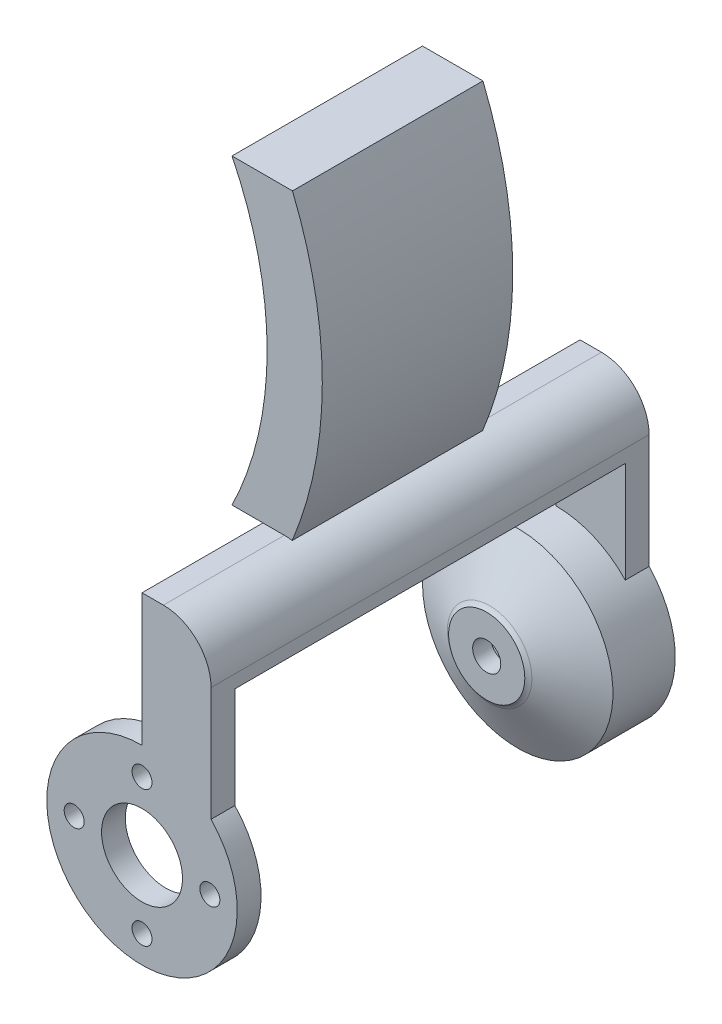
ISO-10303-21;
HEADER;
FILE_DESCRIPTION(('STEP AP214'),'2;1');
FILE_NAME('part.step','',(''),(''),'','','');
FILE_SCHEMA(('AUTOMOTIVE_DESIGN { 1 0 10303 214 1 1 1 1 }'));
ENDSEC;
DATA;
#1=APPLICATION_CONTEXT('core data for automotive mechanical design processes');
#2=APPLICATION_PROTOCOL_DEFINITION('international standard','automotive_design',2000,#1);
#3=PRODUCT_CONTEXT('',#1,'mechanical');
#4=PRODUCT('Part','Part','',(#3));
#5=PRODUCT_RELATED_PRODUCT_CATEGORY('part','',(#4));
#6=PRODUCT_DEFINITION_FORMATION('','',#4);
#7=PRODUCT_DEFINITION_CONTEXT('part definition',#1,'design');
#8=PRODUCT_DEFINITION('design','',#6,#7);
#9=PRODUCT_DEFINITION_SHAPE('','',#8);
#10=(LENGTH_UNIT() NAMED_UNIT(*) SI_UNIT(.MILLI.,.METRE.));
#11=(NAMED_UNIT(*) PLANE_ANGLE_UNIT() SI_UNIT($,.RADIAN.));
#12=(NAMED_UNIT(*) SI_UNIT($,.STERADIAN.) SOLID_ANGLE_UNIT());
#13=UNCERTAINTY_MEASURE_WITH_UNIT(LENGTH_MEASURE(1.E-05),#10,'distance_accuracy_value','');
#14=(GEOMETRIC_REPRESENTATION_CONTEXT(3) GLOBAL_UNCERTAINTY_ASSIGNED_CONTEXT((#13)) GLOBAL_UNIT_ASSIGNED_CONTEXT((#10,
#11,#12)) REPRESENTATION_CONTEXT('',''));
#15=CARTESIAN_POINT('',(0.,0.,0.));
#16=DIRECTION('',(0.,0.,1.));
#17=DIRECTION('',(1.,0.,0.));
#18=AXIS2_PLACEMENT_3D('',#15,#16,#17);
#19=CARTESIAN_POINT('',(0.,-15.875,23.));
#20=DIRECTION('',(0.,1.,0.));
#21=DIRECTION('',(-1.,0.,0.));
#22=AXIS2_PLACEMENT_3D('',#19,#20,#21);
#23=PLANE('',#22);
#24=DIRECTION('',(1.,0.,0.));
#25=VECTOR('',#24,1.);
#26=CARTESIAN_POINT('',(0.,-15.875,23.));
#27=LINE('',#26,#25);
#28=CARTESIAN_POINT('',(0.,-15.875,23.));
#29=VERTEX_POINT('',#28);
#30=CARTESIAN_POINT('',(2.25,-15.875,23.));
#31=VERTEX_POINT('',#30);
#32=EDGE_CURVE('E285',#29,#31,#27,.T.);
#33=ORIENTED_EDGE('',*,*,#32,.T.);
#34=DIRECTION('',(0.,0.,1.));
#35=VECTOR('',#34,1.);
#36=CARTESIAN_POINT('',(2.25,-15.875,23.));
#37=LINE('',#36,#35);
#38=CARTESIAN_POINT('',(2.25,-15.875,10.3));
#39=VERTEX_POINT('',#38);
#40=EDGE_CURVE('E365',#31,#39,#37,.F.);
#41=ORIENTED_EDGE('',*,*,#40,.T.);
#42=DIRECTION('',(1.,0.,0.));
#43=VECTOR('',#42,1.);
#44=CARTESIAN_POINT('',(-3.25,-15.875,10.3));
#45=LINE('',#44,#43);
#46=CARTESIAN_POINT('',(0.,-15.875,10.3));
#47=VERTEX_POINT('',#46);
#48=EDGE_CURVE('E189',#47,#39,#45,.T.);
#49=ORIENTED_EDGE('',*,*,#48,.F.);
#50=DIRECTION('',(0.,0.,-1.));
#51=VECTOR('',#50,1.);
#52=CARTESIAN_POINT('',(0.,-15.875,10.));
#53=LINE('',#52,#51);
#54=EDGE_CURVE('E333',#29,#47,#53,.T.);
#55=ORIENTED_EDGE('',*,*,#54,.F.);
#56=EDGE_LOOP('',(#33,#41,#49,#55));
#57=FACE_BOUND('',#56,.T.);
#58=ADVANCED_FACE('F49',(#57),#23,.T.);
#59=CARTESIAN_POINT('',(0.,-39.7417,-23.));
#60=DIRECTION('',(0.,0.,1.));
#61=DIRECTION('',(1.,0.,0.));
#62=AXIS2_PLACEMENT_3D('',#59,#60,#61);
#63=CYLINDRICAL_SURFACE('',#62,1.475);
#64=CARTESIAN_POINT('',(0.,-39.7417,-13.2));
#65=DIRECTION('',(0.,0.,1.));
#66=DIRECTION('',(1.,0.,0.));
#67=AXIS2_PLACEMENT_3D('',#64,#65,#66);
#68=CIRCLE('',#67,1.475);
#69=CARTESIAN_POINT('',(1.475,-39.7417,-13.2));
#70=VERTEX_POINT('',#69);
#71=EDGE_CURVE('E210',#70,#70,#68,.T.);
#72=ORIENTED_EDGE('',*,*,#71,.T.);
#73=EDGE_LOOP('',(#72));
#74=FACE_BOUND('',#73,.T.);
#75=CARTESIAN_POINT('',(0.,-39.7417,-15.1));
#76=DIRECTION('',(0.,0.,-1.));
#77=DIRECTION('',(-1.,0.,0.));
#78=AXIS2_PLACEMENT_3D('',#75,#76,#77);
#79=CIRCLE('',#78,1.475);
#80=CARTESIAN_POINT('',(-1.475,-39.7417,-15.1));
#81=VERTEX_POINT('',#80);
#82=EDGE_CURVE('E160',#81,#81,#79,.F.);
#83=ORIENTED_EDGE('',*,*,#82,.F.);
#84=EDGE_LOOP('',(#83));
#85=FACE_BOUND('',#84,.T.);
#86=ADVANCED_FACE('F447',(#74,#85),#63,.F.);
#87=CARTESIAN_POINT('',(-25.,-49.7417,-20.5));
#88=DIRECTION('',(0.,0.,-1.));
#89=DIRECTION('',(-1.,0.,0.));
#90=AXIS2_PLACEMENT_3D('',#87,#88,#89);
#91=PLANE('',#90);
#92=CARTESIAN_POINT('',(0.,-39.7417,-20.5));
#93=DIRECTION('',(0.,0.,1.));
#94=DIRECTION('',(1.,0.,0.));
#95=AXIS2_PLACEMENT_3D('',#92,#93,#94);
#96=CIRCLE('',#95,9.99999999999999);
#97=CARTESIAN_POINT('',(7.24999999999999,-32.854211343022,-20.5));
#98=VERTEX_POINT('',#97);
#99=CARTESIAN_POINT('',(0.,-29.7417,-20.5));
#100=VERTEX_POINT('',#99);
#101=EDGE_CURVE('E218',#98,#100,#96,.T.);
#102=ORIENTED_EDGE('',*,*,#101,.F.);
#103=DIRECTION('',(0.,1.,0.));
#104=VECTOR('',#103,1.);
#105=CARTESIAN_POINT('',(7.25,0.,-20.5));
#106=LINE('',#105,#104);
#107=CARTESIAN_POINT('',(7.25,-22.2417,-20.5));
#108=VERTEX_POINT('',#107);
#109=EDGE_CURVE('E256',#98,#108,#106,.T.);
#110=ORIENTED_EDGE('',*,*,#109,.T.);
#111=DIRECTION('',(1.,0.,0.));
#112=VECTOR('',#111,1.);
#113=CARTESIAN_POINT('',(-25.,-22.2417,-20.5));
#114=LINE('',#113,#112);
#115=CARTESIAN_POINT('',(0.,-22.2417,-20.5));
#116=VERTEX_POINT('',#115);
#117=EDGE_CURVE('E221',#116,#108,#114,.T.);
#118=ORIENTED_EDGE('',*,*,#117,.F.);
#119=DIRECTION('',(0.,1.,0.));
#120=VECTOR('',#119,1.);
#121=CARTESIAN_POINT('',(0.,0.,-20.5));
#122=LINE('',#121,#120);
#123=EDGE_CURVE('E260',#100,#116,#122,.T.);
#124=ORIENTED_EDGE('',*,*,#123,.F.);
#125=EDGE_LOOP('',(#102,#110,#118,#124));
#126=FACE_BOUND('',#125,.T.);
#127=ADVANCED_FACE('F425',(#126),#91,.F.);
#128=CARTESIAN_POINT('',(0.,-39.7417,23.));
#129=DIRECTION('',(0.,0.,-1.));
#130=DIRECTION('',(-1.,0.,0.));
#131=AXIS2_PLACEMENT_3D('',#128,#129,#130);
#132=CYLINDRICAL_SURFACE('',#131,10.);
#133=CARTESIAN_POINT('',(0.,-39.7417,-16.4558261025671));
#134=DIRECTION('',(0.,0.,-1.));
#135=DIRECTION('',(-1.,0.,0.));
#136=AXIS2_PLACEMENT_3D('',#133,#134,#135);
#137=CIRCLE('',#136,10.);
#138=CARTESIAN_POINT('',(-10.,-39.7417,-16.4558261025671));
#139=VERTEX_POINT('',#138);
#140=EDGE_CURVE('E347',#139,#139,#137,.T.);
#141=ORIENTED_EDGE('',*,*,#140,.T.);
#142=EDGE_LOOP('',(#141));
#143=FACE_BOUND('',#142,.T.);
#144=DIRECTION('',(0.,0.,-1.));
#145=VECTOR('',#144,1.);
#146=CARTESIAN_POINT('',(7.25,-32.854211343022,23.));
#147=LINE('',#146,#145);
#148=CARTESIAN_POINT('',(7.25,-32.854211343022,-23.));
#149=VERTEX_POINT('',#148);
#150=EDGE_CURVE('E305',#98,#149,#147,.T.);
#151=ORIENTED_EDGE('',*,*,#150,.F.);
#152=ORIENTED_EDGE('',*,*,#101,.T.);
#153=DIRECTION('',(0.,0.,-1.));
#154=VECTOR('',#153,1.);
#155=CARTESIAN_POINT('',(0.,-29.7417,23.));
#156=LINE('',#155,#154);
#157=CARTESIAN_POINT('',(0.,-29.7417,-23.));
#158=VERTEX_POINT('',#157);
#159=EDGE_CURVE('E327',#100,#158,#156,.T.);
#160=ORIENTED_EDGE('',*,*,#159,.T.);
#161=CARTESIAN_POINT('',(0.,-39.7417,-23.));
#162=DIRECTION('',(0.,0.,1.));
#163=DIRECTION('',(1.,0.,0.));
#164=AXIS2_PLACEMENT_3D('',#161,#162,#163);
#165=CIRCLE('',#164,10.);
#166=EDGE_CURVE('E309',#158,#149,#165,.T.);
#167=ORIENTED_EDGE('',*,*,#166,.T.);
#168=EDGE_LOOP('',(#151,#152,#160,#167));
#169=FACE_BOUND('',#168,.T.);
#170=ADVANCED_FACE('F421',(#143,#169),#132,.T.);
#171=CARTESIAN_POINT('',(0.,-39.7417,23.));
#172=DIRECTION('',(0.,0.,-1.));
#173=DIRECTION('',(-1.,0.,0.));
#174=AXIS2_PLACEMENT_3D('',#171,#172,#173);
#175=CYLINDRICAL_SURFACE('',#174,4.25000000000001);
#176=CARTESIAN_POINT('',(0.,-39.7417,-23.));
#177=DIRECTION('',(0.,0.,1.));
#178=DIRECTION('',(1.,0.,0.));
#179=AXIS2_PLACEMENT_3D('',#176,#177,#178);
#180=CIRCLE('',#179,4.25000000000001);
#181=CARTESIAN_POINT('',(4.25000000000001,-39.7417,-23.));
#182=VERTEX_POINT('',#181);
#183=EDGE_CURVE('E274',#182,#182,#180,.T.);
#184=ORIENTED_EDGE('',*,*,#183,.F.);
#185=EDGE_LOOP('',(#184));
#186=FACE_BOUND('',#185,.T.);
#187=CARTESIAN_POINT('',(0.,-39.7417,-15.1));
#188=DIRECTION('',(0.,0.,-1.));
#189=DIRECTION('',(-1.,0.,0.));
#190=AXIS2_PLACEMENT_3D('',#187,#188,#189);
#191=CIRCLE('',#190,4.25000000000001);
#192=CARTESIAN_POINT('',(-4.25,-39.7417,-15.1));
#193=VERTEX_POINT('',#192);
#194=EDGE_CURVE('E179',#193,#193,#191,.F.);
#195=ORIENTED_EDGE('',*,*,#194,.T.);
#196=EDGE_LOOP('',(#195));
#197=FACE_BOUND('',#196,.T.);
#198=ADVANCED_FACE('F444',(#186,#197),#175,.F.);
#199=DIRECTION('',(1.,0.,0.));
#200=VECTOR('',#199,1.);
#201=CARTESIAN_POINT('',(-3.25,-15.875,-9.7));
#202=LINE('',#201,#200);
#203=CARTESIAN_POINT('',(0.,-15.875,-9.7));
#204=VERTEX_POINT('',#203);
#205=CARTESIAN_POINT('',(2.25,-15.875,-9.7));
#206=VERTEX_POINT('',#205);
#207=EDGE_CURVE('E202',#204,#206,#202,.T.);
#208=ORIENTED_EDGE('',*,*,#207,.T.);
#209=DIRECTION('',(0.,0.,1.));
#210=VECTOR('',#209,1.);
#211=CARTESIAN_POINT('',(2.25,-15.875,23.));
#212=LINE('',#211,#210);
#213=CARTESIAN_POINT('',(2.25,-15.875,-23.));
#214=VERTEX_POINT('',#213);
#215=EDGE_CURVE('E362',#206,#214,#212,.F.);
#216=ORIENTED_EDGE('',*,*,#215,.T.);
#217=DIRECTION('',(1.,0.,0.));
#218=VECTOR('',#217,1.);
#219=CARTESIAN_POINT('',(0.,-15.875,-23.));
#220=LINE('',#219,#218);
#221=CARTESIAN_POINT('',(0.,-15.875,-23.));
#222=VERTEX_POINT('',#221);
#223=EDGE_CURVE('E316',#222,#214,#220,.T.);
#224=ORIENTED_EDGE('',*,*,#223,.F.);
#225=EDGE_CURVE('E332',#204,#222,#53,.T.);
#226=ORIENTED_EDGE('',*,*,#225,.F.);
#227=EDGE_LOOP('',(#208,#216,#224,#226));
#228=FACE_BOUND('',#227,.T.);
#229=ADVANCED_FACE('F382',(#228),#23,.T.);
#230=CARTESIAN_POINT('',(0.,0.,23.));
#231=DIRECTION('',(1.,0.,0.));
#232=DIRECTION('',(0.,1.,0.));
#233=AXIS2_PLACEMENT_3D('',#230,#231,#232);
#234=PLANE('',#233);
#235=ORIENTED_EDGE('',*,*,#159,.F.);
#236=ORIENTED_EDGE('',*,*,#123,.T.);
#237=DIRECTION('',(0.,0.,1.));
#238=VECTOR('',#237,1.);
#239=CARTESIAN_POINT('',(0.,-22.2417,23.));
#240=LINE('',#239,#238);
#241=CARTESIAN_POINT('',(0.,-22.2417,20.5));
#242=VERTEX_POINT('',#241);
#243=EDGE_CURVE('E264',#116,#242,#240,.T.);
#244=ORIENTED_EDGE('',*,*,#243,.T.);
#245=DIRECTION('',(0.,-1.,0.));
#246=VECTOR('',#245,1.);
#247=CARTESIAN_POINT('',(0.,0.,20.5));
#248=LINE('',#247,#246);
#249=CARTESIAN_POINT('',(0.,-29.7417,20.5));
#250=VERTEX_POINT('',#249);
#251=EDGE_CURVE('E252',#242,#250,#248,.T.);
#252=ORIENTED_EDGE('',*,*,#251,.T.);
#253=CARTESIAN_POINT('',(0.,-29.7417,23.));
#254=VERTEX_POINT('',#253);
#255=EDGE_CURVE('E328',#254,#250,#156,.T.);
#256=ORIENTED_EDGE('',*,*,#255,.F.);
#257=DIRECTION('',(0.,-1.,0.));
#258=VECTOR('',#257,1.);
#259=CARTESIAN_POINT('',(0.,0.,23.));
#260=LINE('',#259,#258);
#261=EDGE_CURVE('E273',#29,#254,#260,.T.);
#262=ORIENTED_EDGE('',*,*,#261,.F.);
#263=ORIENTED_EDGE('',*,*,#54,.T.);
#264=EDGE_CURVE('E338',#47,#204,#53,.T.);
#265=ORIENTED_EDGE('',*,*,#264,.T.);
#266=ORIENTED_EDGE('',*,*,#225,.T.);
#267=DIRECTION('',(0.,-1.,0.));
#268=VECTOR('',#267,1.);
#269=CARTESIAN_POINT('',(0.,0.,-23.));
#270=LINE('',#269,#268);
#271=EDGE_CURVE('E268',#222,#158,#270,.T.);
#272=ORIENTED_EDGE('',*,*,#271,.T.);
#273=EDGE_LOOP('',(#235,#236,#244,#252,#256,#262,#263,#265,#266,#272));
#274=FACE_BOUND('',#273,.T.);
#275=ADVANCED_FACE('F412',(#274),#234,.F.);
#276=CARTESIAN_POINT('',(0.,-39.7417,20.5));
#277=DIRECTION('',(0.,0.,1.));
#278=DIRECTION('',(0.,-1.,0.));
#279=AXIS2_PLACEMENT_3D('',#276,#277,#278);
#280=CIRCLE('',#279,10.);
#281=CARTESIAN_POINT('',(7.25,-32.854211343022,20.5));
#282=VERTEX_POINT('',#281);
#283=EDGE_CURVE('E249',#250,#282,#280,.T.);
#284=ORIENTED_EDGE('',*,*,#283,.T.);
#285=CARTESIAN_POINT('',(7.25,-32.854211343022,23.));
#286=VERTEX_POINT('',#285);
#287=EDGE_CURVE('E323',#286,#282,#147,.T.);
#288=ORIENTED_EDGE('',*,*,#287,.F.);
#289=CARTESIAN_POINT('',(0.,-39.7417,23.));
#290=DIRECTION('',(0.,0.,1.));
#291=DIRECTION('',(1.,0.,0.));
#292=AXIS2_PLACEMENT_3D('',#289,#290,#291);
#293=CIRCLE('',#292,10.);
#294=EDGE_CURVE('E278',#254,#286,#293,.T.);
#295=ORIENTED_EDGE('',*,*,#294,.F.);
#296=ORIENTED_EDGE('',*,*,#255,.T.);
#297=EDGE_LOOP('',(#284,#288,#295,#296));
#298=FACE_BOUND('',#297,.T.);
#299=ADVANCED_FACE('F432',(#298),#132,.T.);
#300=CARTESIAN_POINT('',(7.25,0.,23.));
#301=DIRECTION('',(1.,0.,0.));
#302=DIRECTION('',(0.,1.,0.));
#303=AXIS2_PLACEMENT_3D('',#300,#301,#302);
#304=PLANE('',#303);
#305=DIRECTION('',(0.,-1.,0.));
#306=VECTOR('',#305,1.);
#307=CARTESIAN_POINT('',(7.25,0.,-23.));
#308=LINE('',#307,#306);
#309=CARTESIAN_POINT('',(7.25,-20.875,-23.));
#310=VERTEX_POINT('',#309);
#311=EDGE_CURVE('E313',#310,#149,#308,.T.);
#312=ORIENTED_EDGE('',*,*,#311,.F.);
#313=DIRECTION('',(0.,0.,1.));
#314=VECTOR('',#313,1.);
#315=CARTESIAN_POINT('',(7.25,-20.875,23.));
#316=LINE('',#315,#314);
#317=CARTESIAN_POINT('',(7.25,-20.875,23.));
#318=VERTEX_POINT('',#317);
#319=EDGE_CURVE('E355',#310,#318,#316,.T.);
#320=ORIENTED_EDGE('',*,*,#319,.T.);
#321=DIRECTION('',(0.,-1.,0.));
#322=VECTOR('',#321,1.);
#323=CARTESIAN_POINT('',(7.25,0.,23.));
#324=LINE('',#323,#322);
#325=EDGE_CURVE('E282',#318,#286,#324,.T.);
#326=ORIENTED_EDGE('',*,*,#325,.T.);
#327=ORIENTED_EDGE('',*,*,#287,.T.);
#328=DIRECTION('',(0.,-1.,0.));
#329=VECTOR('',#328,1.);
#330=CARTESIAN_POINT('',(7.25,0.,20.5));
#331=LINE('',#330,#329);
#332=CARTESIAN_POINT('',(7.25,-22.2417,20.5));
#333=VERTEX_POINT('',#332);
#334=EDGE_CURVE('E245',#333,#282,#331,.T.);
#335=ORIENTED_EDGE('',*,*,#334,.F.);
#336=DIRECTION('',(0.,0.,1.));
#337=VECTOR('',#336,1.);
#338=CARTESIAN_POINT('',(7.25,-22.2417,23.));
#339=LINE('',#338,#337);
#340=EDGE_CURVE('E337',#108,#333,#339,.T.);
#341=ORIENTED_EDGE('',*,*,#340,.F.);
#342=ORIENTED_EDGE('',*,*,#109,.F.);
#343=ORIENTED_EDGE('',*,*,#150,.T.);
#344=EDGE_LOOP('',(#312,#320,#326,#327,#335,#341,#342,#343));
#345=FACE_BOUND('',#344,.T.);
#346=ADVANCED_FACE('F402',(#345),#304,.T.);
#347=CARTESIAN_POINT('',(7.125,-39.7417,23.));
#348=DIRECTION('',(0.,0.,-1.));
#349=DIRECTION('',(-1.,0.,0.));
#350=AXIS2_PLACEMENT_3D('',#347,#348,#349);
#351=CYLINDRICAL_SURFACE('',#350,1.05);
#352=CARTESIAN_POINT('',(7.125,-39.7417,20.5));
#353=DIRECTION('',(0.,0.,1.));
#354=DIRECTION('',(0.,-1.,0.));
#355=AXIS2_PLACEMENT_3D('',#352,#353,#354);
#356=CIRCLE('',#355,1.05);
#357=CARTESIAN_POINT('',(7.125,-40.7917,20.5));
#358=VERTEX_POINT('',#357);
#359=EDGE_CURVE('E241',#358,#358,#356,.T.);
#360=ORIENTED_EDGE('',*,*,#359,.F.);
#361=EDGE_LOOP('',(#360));
#362=FACE_BOUND('',#361,.T.);
#363=CARTESIAN_POINT('',(7.125,-39.7417,23.));
#364=DIRECTION('',(0.,0.,1.));
#365=DIRECTION('',(1.,0.,0.));
#366=AXIS2_PLACEMENT_3D('',#363,#364,#365);
#367=CIRCLE('',#366,1.05);
#368=CARTESIAN_POINT('',(8.175,-39.7417,23.));
#369=VERTEX_POINT('',#368);
#370=EDGE_CURVE('E297',#369,#369,#367,.T.);
#371=ORIENTED_EDGE('',*,*,#370,.T.);
#372=EDGE_LOOP('',(#371));
#373=FACE_BOUND('',#372,.T.);
#374=ADVANCED_FACE('F439',(#362,#373),#351,.F.);
#375=CARTESIAN_POINT('',(0.,-46.8667,23.));
#376=DIRECTION('',(0.,0.,-1.));
#377=DIRECTION('',(-1.,0.,0.));
#378=AXIS2_PLACEMENT_3D('',#375,#376,#377);
#379=CYLINDRICAL_SURFACE('',#378,1.05);
#380=CARTESIAN_POINT('',(0.,-46.8667,20.5));
#381=DIRECTION('',(0.,0.,1.));
#382=DIRECTION('',(0.,-1.,0.));
#383=AXIS2_PLACEMENT_3D('',#380,#381,#382);
#384=CIRCLE('',#383,1.05);
#385=CARTESIAN_POINT('',(0.,-47.9167,20.5));
#386=VERTEX_POINT('',#385);
#387=EDGE_CURVE('E237',#386,#386,#384,.T.);
#388=ORIENTED_EDGE('',*,*,#387,.F.);
#389=EDGE_LOOP('',(#388));
#390=FACE_BOUND('',#389,.T.);
#391=CARTESIAN_POINT('',(0.,-46.8667,23.));
#392=DIRECTION('',(0.,0.,1.));
#393=DIRECTION('',(1.,0.,0.));
#394=AXIS2_PLACEMENT_3D('',#391,#392,#393);
#395=CIRCLE('',#394,1.05);
#396=CARTESIAN_POINT('',(1.05000000000001,-46.8667,23.));
#397=VERTEX_POINT('',#396);
#398=EDGE_CURVE('E293',#397,#397,#395,.T.);
#399=ORIENTED_EDGE('',*,*,#398,.T.);
#400=EDGE_LOOP('',(#399));
#401=FACE_BOUND('',#400,.T.);
#402=ADVANCED_FACE('F666',(#390,#401),#379,.F.);
#403=CARTESIAN_POINT('',(-7.12499999999999,-39.7417,23.));
#404=DIRECTION('',(0.,0.,-1.));
#405=DIRECTION('',(-1.,0.,0.));
#406=AXIS2_PLACEMENT_3D('',#403,#404,#405);
#407=CYLINDRICAL_SURFACE('',#406,1.05);
#408=CARTESIAN_POINT('',(-7.12499999999999,-39.7417,20.5));
#409=DIRECTION('',(0.,0.,1.));
#410=DIRECTION('',(0.,-1.,0.));
#411=AXIS2_PLACEMENT_3D('',#408,#409,#410);
#412=CIRCLE('',#411,1.05);
#413=CARTESIAN_POINT('',(-7.12499999999999,-40.7917,20.5));
#414=VERTEX_POINT('',#413);
#415=EDGE_CURVE('E233',#414,#414,#412,.T.);
#416=ORIENTED_EDGE('',*,*,#415,.F.);
#417=EDGE_LOOP('',(#416));
#418=FACE_BOUND('',#417,.T.);
#419=CARTESIAN_POINT('',(-7.12499999999999,-39.7417,23.));
#420=DIRECTION('',(0.,0.,1.));
#421=DIRECTION('',(1.,0.,0.));
#422=AXIS2_PLACEMENT_3D('',#419,#420,#421);
#423=CIRCLE('',#422,1.05);
#424=CARTESIAN_POINT('',(-6.07499999999999,-39.7417,23.));
#425=VERTEX_POINT('',#424);
#426=EDGE_CURVE('E289',#425,#425,#423,.T.);
#427=ORIENTED_EDGE('',*,*,#426,.T.);
#428=EDGE_LOOP('',(#427));
#429=FACE_BOUND('',#428,.T.);
#430=ADVANCED_FACE('F480',(#418,#429),#407,.F.);
#431=CARTESIAN_POINT('',(0.,-32.6167,23.));
#432=DIRECTION('',(0.,0.,-1.));
#433=DIRECTION('',(-1.,0.,0.));
#434=AXIS2_PLACEMENT_3D('',#431,#432,#433);
#435=CYLINDRICAL_SURFACE('',#434,1.05);
#436=CARTESIAN_POINT('',(0.,-32.6167,20.5));
#437=DIRECTION('',(0.,0.,1.));
#438=DIRECTION('',(0.,-1.,0.));
#439=AXIS2_PLACEMENT_3D('',#436,#437,#438);
#440=CIRCLE('',#439,1.05);
#441=CARTESIAN_POINT('',(0.,-33.6667,20.5));
#442=VERTEX_POINT('',#441);
#443=EDGE_CURVE('E229',#442,#442,#440,.T.);
#444=ORIENTED_EDGE('',*,*,#443,.F.);
#445=EDGE_LOOP('',(#444));
#446=FACE_BOUND('',#445,.T.);
#447=CARTESIAN_POINT('',(0.,-32.6167,23.));
#448=DIRECTION('',(0.,0.,1.));
#449=DIRECTION('',(1.,0.,0.));
#450=AXIS2_PLACEMENT_3D('',#447,#448,#449);
#451=CIRCLE('',#450,1.05);
#452=CARTESIAN_POINT('',(1.05000000000001,-32.6167,23.));
#453=VERTEX_POINT('',#452);
#454=EDGE_CURVE('E269',#453,#453,#451,.T.);
#455=ORIENTED_EDGE('',*,*,#454,.T.);
#456=EDGE_LOOP('',(#455));
#457=FACE_BOUND('',#456,.T.);
#458=ADVANCED_FACE('F472',(#446,#457),#435,.F.);
#459=CARTESIAN_POINT('',(0.,-39.7417,20.5));
#460=DIRECTION('',(0.,0.,1.));
#461=DIRECTION('',(0.,-1.,0.));
#462=AXIS2_PLACEMENT_3D('',#459,#460,#461);
#463=CIRCLE('',#462,4.25000000000001);
#464=CARTESIAN_POINT('',(0.,-43.9917,20.5));
#465=VERTEX_POINT('',#464);
#466=EDGE_CURVE('E226',#465,#465,#463,.T.);
#467=ORIENTED_EDGE('',*,*,#466,.F.);
#468=EDGE_LOOP('',(#467));
#469=FACE_BOUND('',#468,.T.);
#470=CARTESIAN_POINT('',(0.,-39.7417,23.));
#471=DIRECTION('',(0.,0.,1.));
#472=DIRECTION('',(1.,0.,0.));
#473=AXIS2_PLACEMENT_3D('',#470,#471,#472);
#474=CIRCLE('',#473,4.25000000000001);
#475=CARTESIAN_POINT('',(4.25000000000001,-39.7417,23.));
#476=VERTEX_POINT('',#475);
#477=EDGE_CURVE('E301',#476,#476,#474,.T.);
#478=ORIENTED_EDGE('',*,*,#477,.T.);
#479=EDGE_LOOP('',(#478));
#480=FACE_BOUND('',#479,.T.);
#481=ADVANCED_FACE('F462',(#469,#480),#175,.F.);
#482=CARTESIAN_POINT('',(0.,0.,23.));
#483=DIRECTION('',(0.,0.,1.));
#484=DIRECTION('',(1.,0.,0.));
#485=AXIS2_PLACEMENT_3D('',#482,#483,#484);
#486=PLANE('',#485);
#487=ORIENTED_EDGE('',*,*,#325,.F.);
#488=CARTESIAN_POINT('',(2.25,-20.875,23.));
#489=DIRECTION('',(0.,0.,1.));
#490=DIRECTION('',(1.,0.,0.));
#491=AXIS2_PLACEMENT_3D('',#488,#489,#490);
#492=CIRCLE('',#491,5.);
#493=EDGE_CURVE('E359',#318,#31,#492,.T.);
#494=ORIENTED_EDGE('',*,*,#493,.T.);
#495=ORIENTED_EDGE('',*,*,#32,.F.);
#496=ORIENTED_EDGE('',*,*,#261,.T.);
#497=ORIENTED_EDGE('',*,*,#294,.T.);
#498=EDGE_LOOP('',(#487,#494,#495,#496,#497));
#499=FACE_BOUND('',#498,.T.);
#500=ORIENTED_EDGE('',*,*,#454,.F.);
#501=EDGE_LOOP('',(#500));
#502=FACE_BOUND('',#501,.T.);
#503=ORIENTED_EDGE('',*,*,#426,.F.);
#504=EDGE_LOOP('',(#503));
#505=FACE_BOUND('',#504,.T.);
#506=ORIENTED_EDGE('',*,*,#398,.F.);
#507=EDGE_LOOP('',(#506));
#508=FACE_BOUND('',#507,.T.);
#509=ORIENTED_EDGE('',*,*,#370,.F.);
#510=EDGE_LOOP('',(#509));
#511=FACE_BOUND('',#510,.T.);
#512=ORIENTED_EDGE('',*,*,#477,.F.);
#513=EDGE_LOOP('',(#512));
#514=FACE_BOUND('',#513,.T.);
#515=ADVANCED_FACE('F396',(#499,#502,#505,#508,#511,#514),#486,.T.);
#516=CARTESIAN_POINT('',(0.,0.,-23.));
#517=DIRECTION('',(0.,0.,1.));
#518=DIRECTION('',(1.,0.,0.));
#519=AXIS2_PLACEMENT_3D('',#516,#517,#518);
#520=PLANE('',#519);
#521=ORIENTED_EDGE('',*,*,#223,.T.);
#522=CARTESIAN_POINT('',(2.25,-20.875,-23.));
#523=DIRECTION('',(0.,0.,1.));
#524=DIRECTION('',(1.,0.,0.));
#525=AXIS2_PLACEMENT_3D('',#522,#523,#524);
#526=CIRCLE('',#525,5.);
#527=EDGE_CURVE('E368',#214,#310,#526,.F.);
#528=ORIENTED_EDGE('',*,*,#527,.T.);
#529=ORIENTED_EDGE('',*,*,#311,.T.);
#530=ORIENTED_EDGE('',*,*,#166,.F.);
#531=ORIENTED_EDGE('',*,*,#271,.F.);
#532=EDGE_LOOP('',(#521,#528,#529,#530,#531));
#533=FACE_BOUND('',#532,.T.);
#534=ORIENTED_EDGE('',*,*,#183,.T.);
#535=EDGE_LOOP('',(#534));
#536=FACE_BOUND('',#535,.T.);
#537=ADVANCED_FACE('F406',(#533,#536),#520,.F.);
#538=CARTESIAN_POINT('',(-25.,-22.2417,-20.5));
#539=DIRECTION('',(0.,1.,0.));
#540=DIRECTION('',(0.,0.,1.));
#541=AXIS2_PLACEMENT_3D('',#538,#539,#540);
#542=PLANE('',#541);
#543=ORIENTED_EDGE('',*,*,#117,.T.);
#544=ORIENTED_EDGE('',*,*,#340,.T.);
#545=DIRECTION('',(1.,0.,0.));
#546=VECTOR('',#545,1.);
#547=CARTESIAN_POINT('',(-25.,-22.2417,20.5));
#548=LINE('',#547,#546);
#549=EDGE_CURVE('E222',#242,#333,#548,.T.);
#550=ORIENTED_EDGE('',*,*,#549,.F.);
#551=ORIENTED_EDGE('',*,*,#243,.F.);
#552=EDGE_LOOP('',(#543,#544,#550,#551));
#553=FACE_BOUND('',#552,.T.);
#554=ADVANCED_FACE('F428',(#553),#542,.F.);
#555=CARTESIAN_POINT('',(-25.,-49.7417,20.5));
#556=DIRECTION('',(0.,0.,1.));
#557=DIRECTION('',(0.,-1.,0.));
#558=AXIS2_PLACEMENT_3D('',#555,#556,#557);
#559=PLANE('',#558);
#560=ORIENTED_EDGE('',*,*,#359,.T.);
#561=EDGE_LOOP('',(#560));
#562=FACE_BOUND('',#561,.T.);
#563=ORIENTED_EDGE('',*,*,#387,.T.);
#564=EDGE_LOOP('',(#563));
#565=FACE_BOUND('',#564,.T.);
#566=ORIENTED_EDGE('',*,*,#415,.T.);
#567=EDGE_LOOP('',(#566));
#568=FACE_BOUND('',#567,.T.);
#569=ORIENTED_EDGE('',*,*,#443,.T.);
#570=EDGE_LOOP('',(#569));
#571=FACE_BOUND('',#570,.T.);
#572=ORIENTED_EDGE('',*,*,#466,.T.);
#573=EDGE_LOOP('',(#572));
#574=FACE_BOUND('',#573,.T.);
#575=ORIENTED_EDGE('',*,*,#549,.T.);
#576=ORIENTED_EDGE('',*,*,#334,.T.);
#577=ORIENTED_EDGE('',*,*,#283,.F.);
#578=ORIENTED_EDGE('',*,*,#251,.F.);
#579=EDGE_LOOP('',(#575,#576,#577,#578));
#580=FACE_BOUND('',#579,.T.);
#581=ADVANCED_FACE('F430',(#562,#565,#568,#571,#574,#580),#559,.F.);
#582=CARTESIAN_POINT('',(0.,-39.7417,-13.2));
#583=DIRECTION('',(0.,0.,1.));
#584=DIRECTION('',(1.,0.,0.));
#585=AXIS2_PLACEMENT_3D('',#582,#583,#584);
#586=PLANE('',#585);
#587=ORIENTED_EDGE('',*,*,#71,.F.);
#588=EDGE_LOOP('',(#587));
#589=FACE_BOUND('',#588,.T.);
#590=CARTESIAN_POINT('',(0.,-39.7417,-13.2));
#591=DIRECTION('',(0.,0.,1.));
#592=DIRECTION('',(1.,0.,0.));
#593=AXIS2_PLACEMENT_3D('',#590,#591,#592);
#594=CIRCLE('',#593,4.);
#595=CARTESIAN_POINT('',(4.,-39.7417,-13.2));
#596=VERTEX_POINT('',#595);
#597=EDGE_CURVE('E214',#596,#596,#594,.T.);
#598=ORIENTED_EDGE('',*,*,#597,.T.);
#599=EDGE_LOOP('',(#598));
#600=FACE_BOUND('',#599,.T.);
#601=ADVANCED_FACE('F489',(#589,#600),#586,.T.);
#602=CARTESIAN_POINT('',(0.,-39.7417,-15.1));
#603=DIRECTION('',(0.,0.,-1.));
#604=DIRECTION('',(-1.,0.,0.));
#605=AXIS2_PLACEMENT_3D('',#602,#603,#604);
#606=PLANE('',#605);
#607=ORIENTED_EDGE('',*,*,#82,.T.);
#608=EDGE_LOOP('',(#607));
#609=FACE_BOUND('',#608,.T.);
#610=ORIENTED_EDGE('',*,*,#194,.F.);
#611=EDGE_LOOP('',(#610));
#612=FACE_BOUND('',#611,.T.);
#613=ADVANCED_FACE('F496',(#609,#612),#606,.T.);
#614=CARTESIAN_POINT('',(-3.25,-15.875,-9.7));
#615=DIRECTION('',(0.,-1.,0.));
#616=DIRECTION('',(0.,0.,-1.));
#617=AXIS2_PLACEMENT_3D('',#614,#615,#616);
#618=PLANE('',#617);
#619=ORIENTED_EDGE('',*,*,#264,.F.);
#620=CARTESIAN_POINT('',(-3.25,-15.875,10.3));
#621=VERTEX_POINT('',#620);
#622=EDGE_CURVE('E173',#621,#47,#45,.T.);
#623=ORIENTED_EDGE('',*,*,#622,.F.);
#624=DIRECTION('',(0.,0.,1.));
#625=VECTOR('',#624,1.);
#626=CARTESIAN_POINT('',(-3.25,-15.875,-9.7));
#627=LINE('',#626,#625);
#628=CARTESIAN_POINT('',(-3.25,-15.875,-9.7));
#629=VERTEX_POINT('',#628);
#630=EDGE_CURVE('E161',#629,#621,#627,.T.);
#631=ORIENTED_EDGE('',*,*,#630,.F.);
#632=EDGE_CURVE('E197',#629,#204,#202,.T.);
#633=ORIENTED_EDGE('',*,*,#632,.T.);
#634=EDGE_LOOP('',(#619,#623,#631,#633));
#635=FACE_BOUND('',#634,.T.);
#636=ADVANCED_FACE('F580',(#635),#618,.T.);
#637=CARTESIAN_POINT('',(-3.25,15.875,-9.7));
#638=DIRECTION('',(0.,-1.,0.));
#639=DIRECTION('',(0.,0.,-1.));
#640=AXIS2_PLACEMENT_3D('',#637,#638,#639);
#641=PLANE('',#640);
#642=DIRECTION('',(0.,0.,1.));
#643=VECTOR('',#642,1.);
#644=CARTESIAN_POINT('',(-3.25,15.875,-9.7));
#645=LINE('',#644,#643);
#646=CARTESIAN_POINT('',(-3.25,15.875,-9.7));
#647=VERTEX_POINT('',#646);
#648=CARTESIAN_POINT('',(-3.25,15.875,10.3));
#649=VERTEX_POINT('',#648);
#650=EDGE_CURVE('E176',#647,#649,#645,.T.);
#651=ORIENTED_EDGE('',*,*,#650,.T.);
#652=DIRECTION('',(1.,0.,0.));
#653=VECTOR('',#652,1.);
#654=CARTESIAN_POINT('',(-3.25,15.875,10.3));
#655=LINE('',#654,#653);
#656=CARTESIAN_POINT('',(3.1,15.875,10.3));
#657=VERTEX_POINT('',#656);
#658=EDGE_CURVE('E167',#649,#657,#655,.T.);
#659=ORIENTED_EDGE('',*,*,#658,.T.);
#660=DIRECTION('',(0.,0.,1.));
#661=VECTOR('',#660,1.);
#662=CARTESIAN_POINT('',(3.1,15.875,-9.7));
#663=LINE('',#662,#661);
#664=CARTESIAN_POINT('',(3.1,15.875,-9.7));
#665=VERTEX_POINT('',#664);
#666=EDGE_CURVE('E154',#665,#657,#663,.T.);
#667=ORIENTED_EDGE('',*,*,#666,.F.);
#668=DIRECTION('',(1.,0.,0.));
#669=VECTOR('',#668,1.);
#670=CARTESIAN_POINT('',(-3.25,15.875,-9.7));
#671=LINE('',#670,#669);
#672=EDGE_CURVE('E192',#647,#665,#671,.T.);
#673=ORIENTED_EDGE('',*,*,#672,.F.);
#674=EDGE_LOOP('',(#651,#659,#667,#673));
#675=FACE_BOUND('',#674,.T.);
#676=ADVANCED_FACE('F175',(#675),#641,.F.);
#677=CARTESIAN_POINT('',(-35.5607470510974,0.,-9.7));
#678=DIRECTION('',(0.,0.,1.));
#679=DIRECTION('',(1.,0.,0.));
#680=AXIS2_PLACEMENT_3D('',#677,#678,#679);
#681=CYLINDRICAL_SURFACE('',#680,41.793169149383);
#682=ORIENTED_EDGE('',*,*,#666,.T.);
#683=CARTESIAN_POINT('',(-35.5607470510974,0.,10.3));
#684=DIRECTION('',(0.,0.,-1.));
#685=DIRECTION('',(-1.,0.,0.));
#686=AXIS2_PLACEMENT_3D('',#683,#684,#685);
#687=CIRCLE('',#686,41.793169149383);
#688=CARTESIAN_POINT('',(3.07199513442295,-15.943030413822,10.3));
#689=VERTEX_POINT('',#688);
#690=EDGE_CURVE('E71',#657,#689,#687,.T.);
#691=ORIENTED_EDGE('',*,*,#690,.T.);
#692=DIRECTION('',(0.,0.,1.));
#693=VECTOR('',#692,1.);
#694=CARTESIAN_POINT('',(3.07199513442295,-15.943030413822,10.3));
#695=LINE('',#694,#693);
#696=CARTESIAN_POINT('',(3.07199513442295,-15.943030413822,-9.7));
#697=VERTEX_POINT('',#696);
#698=EDGE_CURVE('E58',#689,#697,#695,.F.);
#699=ORIENTED_EDGE('',*,*,#698,.T.);
#700=CARTESIAN_POINT('',(-35.5607470510974,0.,-9.7));
#701=DIRECTION('',(0.,0.,-1.));
#702=DIRECTION('',(-1.,0.,0.));
#703=AXIS2_PLACEMENT_3D('',#700,#701,#702);
#704=CIRCLE('',#703,41.793169149383);
#705=EDGE_CURVE('E64',#665,#697,#704,.T.);
#706=ORIENTED_EDGE('',*,*,#705,.F.);
#707=EDGE_LOOP('',(#682,#691,#699,#706));
#708=FACE_BOUND('',#707,.T.);
#709=ADVANCED_FACE('F155',(#708),#681,.T.);
#710=CARTESIAN_POINT('',(-35.5607470510974,0.,-9.7));
#711=DIRECTION('',(0.,0.,1.));
#712=DIRECTION('',(1.,0.,0.));
#713=AXIS2_PLACEMENT_3D('',#710,#711,#712);
#714=CYLINDRICAL_SURFACE('',#713,36.);
#715=ORIENTED_EDGE('',*,*,#630,.T.);
#716=CARTESIAN_POINT('',(-35.5607470510974,0.,10.3));
#717=DIRECTION('',(0.,0.,-1.));
#718=DIRECTION('',(-1.,0.,0.));
#719=AXIS2_PLACEMENT_3D('',#716,#717,#718);
#720=CIRCLE('',#719,36.);
#721=EDGE_CURVE('E188',#649,#621,#720,.T.);
#722=ORIENTED_EDGE('',*,*,#721,.F.);
#723=ORIENTED_EDGE('',*,*,#650,.F.);
#724=CARTESIAN_POINT('',(-35.5607470510974,0.,-9.7));
#725=DIRECTION('',(0.,0.,-1.));
#726=DIRECTION('',(-1.,0.,0.));
#727=AXIS2_PLACEMENT_3D('',#724,#725,#726);
#728=CIRCLE('',#727,36.);
#729=EDGE_CURVE('E201',#647,#629,#728,.T.);
#730=ORIENTED_EDGE('',*,*,#729,.T.);
#731=EDGE_LOOP('',(#715,#722,#723,#730));
#732=FACE_BOUND('',#731,.T.);
#733=ADVANCED_FACE('F515',(#732),#714,.F.);
#734=CARTESIAN_POINT('',(-35.5607470510974,0.,-9.7));
#735=DIRECTION('',(0.,0.,-1.));
#736=DIRECTION('',(-1.,0.,0.));
#737=AXIS2_PLACEMENT_3D('',#734,#735,#736);
#738=PLANE('',#737);
#739=ORIENTED_EDGE('',*,*,#672,.T.);
#740=ORIENTED_EDGE('',*,*,#705,.T.);
#741=CARTESIAN_POINT('',(2.25,-20.875,-9.7));
#742=DIRECTION('',(0.,0.,-1.));
#743=DIRECTION('',(-1.,0.,0.));
#744=AXIS2_PLACEMENT_3D('',#741,#742,#743);
#745=CIRCLE('',#744,5.);
#746=EDGE_CURVE('E11',#697,#206,#745,.F.);
#747=ORIENTED_EDGE('',*,*,#746,.T.);
#748=ORIENTED_EDGE('',*,*,#207,.F.);
#749=ORIENTED_EDGE('',*,*,#632,.F.);
#750=ORIENTED_EDGE('',*,*,#729,.F.);
#751=EDGE_LOOP('',(#739,#740,#747,#748,#749,#750));
#752=FACE_BOUND('',#751,.T.);
#753=ADVANCED_FACE('F378',(#752),#738,.T.);
#754=CARTESIAN_POINT('',(-35.5607470510974,0.,10.3));
#755=DIRECTION('',(0.,0.,-1.));
#756=DIRECTION('',(-1.,0.,0.));
#757=AXIS2_PLACEMENT_3D('',#754,#755,#756);
#758=PLANE('',#757);
#759=ORIENTED_EDGE('',*,*,#658,.F.);
#760=ORIENTED_EDGE('',*,*,#721,.T.);
#761=ORIENTED_EDGE('',*,*,#622,.T.);
#762=ORIENTED_EDGE('',*,*,#48,.T.);
#763=CARTESIAN_POINT('',(2.25,-20.875,10.3));
#764=DIRECTION('',(0.,0.,-1.));
#765=DIRECTION('',(-1.,0.,0.));
#766=AXIS2_PLACEMENT_3D('',#763,#764,#765);
#767=CIRCLE('',#766,5.);
#768=EDGE_CURVE('E170',#39,#689,#767,.T.);
#769=ORIENTED_EDGE('',*,*,#768,.T.);
#770=ORIENTED_EDGE('',*,*,#690,.F.);
#771=EDGE_LOOP('',(#759,#760,#761,#762,#769,#770));
#772=FACE_BOUND('',#771,.T.);
#773=ADVANCED_FACE('F165',(#772),#758,.F.);
#774=CARTESIAN_POINT('',(0.,-39.7417,-13.3259710170945));
#775=DIRECTION('',(0.,0.,-1.));
#776=DIRECTION('',(-1.,0.,0.));
#777=AXIS2_PLACEMENT_3D('',#774,#775,#776);
#778=CONICAL_SURFACE('',#777,4.08617908189938,1.08402802996173);
#779=CARTESIAN_POINT('',(0.,-39.7417,-13.5098849641895));
#780=DIRECTION('',(0.,0.,-1.));
#781=DIRECTION('',(-1.,0.,0.));
#782=AXIS2_PLACEMENT_3D('',#779,#780,#781);
#783=CIRCLE('',#782,4.43368211886388);
#784=CARTESIAN_POINT('',(-4.43368211886388,-39.7417,-13.5098849641895));
#785=VERTEX_POINT('',#784);
#786=EDGE_CURVE('E351',#785,#785,#783,.T.);
#787=CARTESIAN_POINT('',(-4.43368211886388,-39.7417,-13.5098849641895));
#788=CARTESIAN_POINT('',(-4.49166459679238,-39.7417,-13.5405718510476));
#789=CARTESIAN_POINT('',(-4.54964707472088,-39.7417,-13.5712587379057));
#790=CARTESIAN_POINT('',(-4.66561203057788,-39.7417,-13.6326325116219));
#791=CARTESIAN_POINT('',(-4.72359450850638,-39.7417,-13.66331939848));
#792=CARTESIAN_POINT('',(-4.83955946436339,-39.7417,-13.7246931721962));
#793=CARTESIAN_POINT('',(-4.89754194229189,-39.7417,-13.7553800590543));
#794=CARTESIAN_POINT('',(-5.01350689814889,-39.7417,-13.8167538327705));
#795=CARTESIAN_POINT('',(-5.07148937607739,-39.7417,-13.8474407196286));
#796=CARTESIAN_POINT('',(-5.18745433193439,-39.7417,-13.9088144933448));
#797=CARTESIAN_POINT('',(-5.24543680986289,-39.7417,-13.9395013802029));
#798=CARTESIAN_POINT('',(-5.3614017657199,-39.7417,-14.0008751539191));
#799=CARTESIAN_POINT('',(-5.4193842436484,-39.7417,-14.0315620407772));
#800=CARTESIAN_POINT('',(-5.5353491995054,-39.7417,-14.0929358144934));
#801=CARTESIAN_POINT('',(-5.5933316774339,-39.7417,-14.1236227013515));
#802=CARTESIAN_POINT('',(-5.70929663329091,-39.7417,-14.1849964750677));
#803=CARTESIAN_POINT('',(-5.76727911121941,-39.7417,-14.2156833619258));
#804=CARTESIAN_POINT('',(-5.88324406707641,-39.7417,-14.277057135642));
#805=CARTESIAN_POINT('',(-5.94122654500491,-39.7417,-14.3077440225001));
#806=CARTESIAN_POINT('',(-6.05719150086191,-39.7417,-14.3691177962163));
#807=CARTESIAN_POINT('',(-6.11517397879041,-39.7417,-14.3998046830744));
#808=CARTESIAN_POINT('',(-6.23113893464742,-39.7417,-14.4611784567906));
#809=CARTESIAN_POINT('',(-6.28912141257592,-39.7417,-14.4918653436487));
#810=CARTESIAN_POINT('',(-6.40508636843292,-39.7417,-14.5532391173649));
#811=CARTESIAN_POINT('',(-6.46306884636142,-39.7417,-14.583926004223));
#812=CARTESIAN_POINT('',(-6.57903380221842,-39.7417,-14.6452997779392));
#813=CARTESIAN_POINT('',(-6.63701628014692,-39.7417,-14.6759866647973));
#814=CARTESIAN_POINT('',(-6.75298123600393,-39.7417,-14.7373604385135));
#815=CARTESIAN_POINT('',(-6.81096371393243,-39.7417,-14.7680473253716));
#816=CARTESIAN_POINT('',(-6.92692866978943,-39.7417,-14.8294210990878));
#817=CARTESIAN_POINT('',(-6.98491114771793,-39.7417,-14.8601079859459));
#818=CARTESIAN_POINT('',(-7.10087610357493,-39.7417,-14.9214817596621));
#819=CARTESIAN_POINT('',(-7.15885858150344,-39.7417,-14.9521686465202));
#820=CARTESIAN_POINT('',(-7.27482353736044,-39.7417,-15.0135424202364));
#821=CARTESIAN_POINT('',(-7.33280601528894,-39.7417,-15.0442293070945));
#822=CARTESIAN_POINT('',(-7.44877097114594,-39.7417,-15.1056030808107));
#823=CARTESIAN_POINT('',(-7.50675344907444,-39.7417,-15.1362899676688));
#824=CARTESIAN_POINT('',(-7.62271840493145,-39.7417,-15.197663741385));
#825=CARTESIAN_POINT('',(-7.68070088285995,-39.7417,-15.2283506282431));
#826=CARTESIAN_POINT('',(-7.79666583871695,-39.7417,-15.2897244019593));
#827=CARTESIAN_POINT('',(-7.85464831664545,-39.7417,-15.3204112888174));
#828=CARTESIAN_POINT('',(-7.97061327250245,-39.7417,-15.3817850625336));
#829=CARTESIAN_POINT('',(-8.02859575043096,-39.7417,-15.4124719493917));
#830=CARTESIAN_POINT('',(-8.14456070628796,-39.7417,-15.4738457231079));
#831=CARTESIAN_POINT('',(-8.20254318421646,-39.7417,-15.504532609966));
#832=CARTESIAN_POINT('',(-8.31850814007346,-39.7417,-15.5659063836822));
#833=CARTESIAN_POINT('',(-8.37649061800196,-39.7417,-15.5965932705403));
#834=CARTESIAN_POINT('',(-8.49245557385897,-39.7417,-15.6579670442565));
#835=CARTESIAN_POINT('',(-8.55043805178747,-39.7417,-15.6886539311146));
#836=CARTESIAN_POINT('',(-8.66640300764447,-39.7417,-15.7500277048308));
#837=CARTESIAN_POINT('',(-8.72438548557297,-39.7417,-15.7807145916889));
#838=CARTESIAN_POINT('',(-8.84035044142997,-39.7417,-15.8420883654051));
#839=CARTESIAN_POINT('',(-8.89833291935848,-39.7417,-15.8727752522632));
#840=CARTESIAN_POINT('',(-9.01429787521548,-39.7417,-15.9341490259794));
#841=CARTESIAN_POINT('',(-9.07228035314398,-39.7417,-15.9648359128375));
#842=CARTESIAN_POINT('',(-9.18824530900098,-39.7417,-16.0262096865537));
#843=CARTESIAN_POINT('',(-9.24622778692948,-39.7417,-16.0568965734118));
#844=CARTESIAN_POINT('',(-9.36219274278649,-39.7417,-16.118270347128));
#845=CARTESIAN_POINT('',(-9.42017522071499,-39.7417,-16.1489572339861));
#846=CARTESIAN_POINT('',(-9.53614017657199,-39.7417,-16.2103310077023));
#847=CARTESIAN_POINT('',(-9.59412265450049,-39.7417,-16.2410178945604));
#848=CARTESIAN_POINT('',(-9.71008761035749,-39.7417,-16.3023916682766));
#849=CARTESIAN_POINT('',(-9.768070088286,-39.7417,-16.3330785551347));
#850=CARTESIAN_POINT('',(-9.884035044143,-39.7417,-16.3944523288509));
#851=CARTESIAN_POINT('',(-9.9420175220715,-39.7417,-16.425139215709));
#852=CARTESIAN_POINT('',(-10.,-39.7417,-16.4558261025671));
#853=B_SPLINE_CURVE_WITH_KNOTS('',3,(#787,#788,#789,#790,#791,#792,#793,#794,#795,#796,#797,
#798,#799,#800,#801,#802,#803,#804,#805,#806,#807,#808,#809,#810,#811,#812,#813,#814,#815,#816,
#817,#818,#819,#820,#821,#822,#823,#824,#825,#826,#827,#828,#829,#830,#831,#832,#833,#834,#835,
#836,#837,#838,#839,#840,#841,#842,#843,#844,#845,#846,#847,#848,#849,#850,#851,#852),
.UNSPECIFIED.,.F.,.F.,(4,2,2,2,2,2,2,2,2,2,2,2,2,2,2,2,2,2,2,2,2,2,2,2,2,2,2,2,2,2,2,2,4),(0.,
0.196806694362614,0.393613388725227,0.590420083087841,0.787226777450453,0.984033471813068,
1.18084016617568,1.37764686053829,1.57445355490091,1.77126024926352,1.96806694362613,
2.16487363798875,2.36168033235136,2.55848702671397,2.75529372107659,2.9521004154392,
3.14890710980182,3.34571380416443,3.54252049852704,3.73932719288966,3.93613388725227,
4.13294058161488,4.3297472759775,4.52655397034011,4.72336066470272,4.92016735906534,
5.11697405342795,5.31378074779056,5.51058744215318,5.70739413651579,5.90420083087841,
6.10100752524102,6.29781421960363),.UNSPECIFIED.);
#854=EDGE_CURVE('BSEAM532',#785,#139,#853,.T.);
#855=ORIENTED_EDGE('',*,*,#786,.T.);
#856=ORIENTED_EDGE('',*,*,#140,.F.);
#857=ORIENTED_EDGE('',*,*,#854,.T.);
#858=ORIENTED_EDGE('',*,*,#854,.F.);
#859=EDGE_LOOP('',(#855,#857,#856,#858));
#860=FACE_BOUND('',#859,.T.);
#861=ADVANCED_FACE('F532',(#860),#778,.T.);
#862=CARTESIAN_POINT('',(0.,-39.7417,-11.7421866209105));
#863=DIRECTION('',(0.,0.,1.));
#864=DIRECTION('',(1.,0.,0.));
#865=AXIS2_PLACEMENT_3D('',#862,#863,#864);
#866=TOROIDAL_SURFACE('',#865,5.3692261141782,2.);
#867=ORIENTED_EDGE('',*,*,#786,.F.);
#868=EDGE_LOOP('',(#867));
#869=FACE_BOUND('',#868,.T.);
#870=ORIENTED_EDGE('',*,*,#597,.F.);
#871=EDGE_LOOP('',(#870));
#872=FACE_BOUND('',#871,.T.);
#873=ADVANCED_FACE('F539',(#869,#872),#866,.F.);
#874=CARTESIAN_POINT('',(2.25,-20.875,23.));
#875=DIRECTION('',(0.,0.,1.));
#876=DIRECTION('',(1.,0.,0.));
#877=AXIS2_PLACEMENT_3D('',#874,#875,#876);
#878=CYLINDRICAL_SURFACE('',#877,5.);
#879=ORIENTED_EDGE('',*,*,#768,.F.);
#880=ORIENTED_EDGE('',*,*,#40,.F.);
#881=ORIENTED_EDGE('',*,*,#493,.F.);
#882=ORIENTED_EDGE('',*,*,#319,.F.);
#883=ORIENTED_EDGE('',*,*,#527,.F.);
#884=ORIENTED_EDGE('',*,*,#215,.F.);
#885=ORIENTED_EDGE('',*,*,#746,.F.);
#886=ORIENTED_EDGE('',*,*,#698,.F.);
#887=EDGE_LOOP('',(#879,#880,#881,#882,#883,#884,#885,#886));
#888=FACE_BOUND('',#887,.T.);
#889=ADVANCED_FACE('F51',(#888),#878,.T.);
#890=CLOSED_SHELL('',(#58,#86,#127,#170,#198,#229,#275,#299,#346,#374,#402,#430,#458,#481,#515,
#537,#554,#581,#601,#613,#636,#676,#709,#733,#753,#773,#861,#873,#889));
#891=MANIFOLD_SOLID_BREP('B2',#890);
#892=ADVANCED_BREP_SHAPE_REPRESENTATION('',(#18,#891),#14);
#893=SHAPE_DEFINITION_REPRESENTATION(#9,#892);
ENDSEC;
END-ISO-10303-21;
